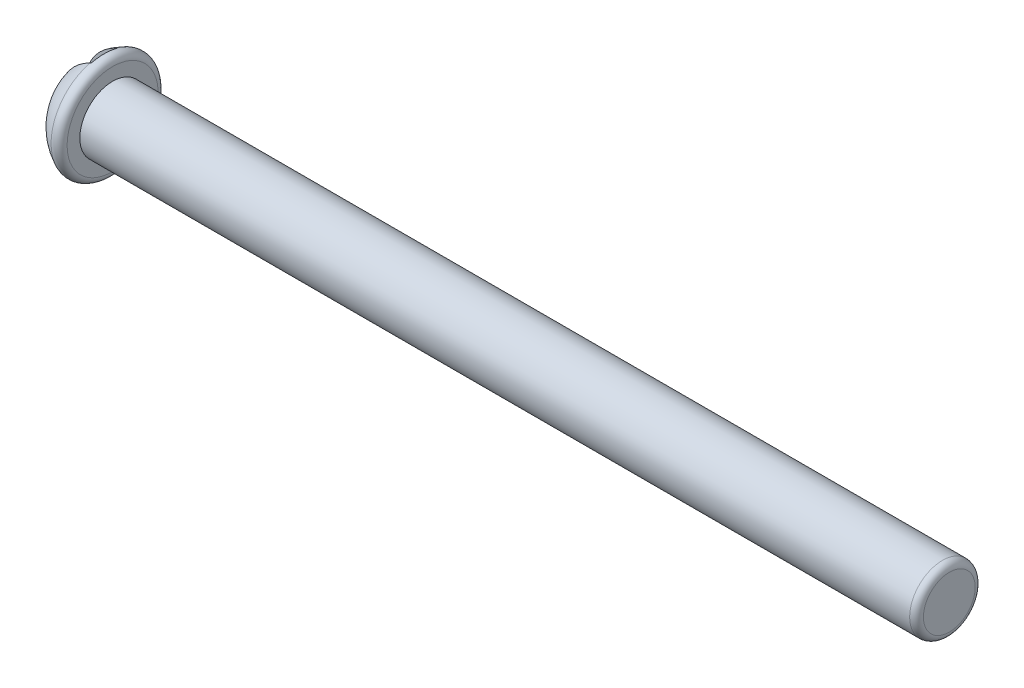
ISO-10303-21;
HEADER;
FILE_DESCRIPTION(('STEP AP214'),'2;1');
FILE_NAME('part.step','',(''),(''),'','','');
FILE_SCHEMA(('AUTOMOTIVE_DESIGN { 1 0 10303 214 1 1 1 1 }'));
ENDSEC;
DATA;
#1=APPLICATION_CONTEXT('core data for automotive mechanical design processes');
#2=APPLICATION_PROTOCOL_DEFINITION('international standard','automotive_design',2000,#1);
#3=PRODUCT_CONTEXT('',#1,'mechanical');
#4=PRODUCT('Part','Part','',(#3));
#5=PRODUCT_RELATED_PRODUCT_CATEGORY('part','',(#4));
#6=PRODUCT_DEFINITION_FORMATION('','',#4);
#7=PRODUCT_DEFINITION_CONTEXT('part definition',#1,'design');
#8=PRODUCT_DEFINITION('design','',#6,#7);
#9=PRODUCT_DEFINITION_SHAPE('','',#8);
#10=(LENGTH_UNIT() NAMED_UNIT(*) SI_UNIT(.MILLI.,.METRE.));
#11=(NAMED_UNIT(*) PLANE_ANGLE_UNIT() SI_UNIT($,.RADIAN.));
#12=(NAMED_UNIT(*) SI_UNIT($,.STERADIAN.) SOLID_ANGLE_UNIT());
#13=UNCERTAINTY_MEASURE_WITH_UNIT(LENGTH_MEASURE(1.E-05),#10,'distance_accuracy_value','');
#14=(GEOMETRIC_REPRESENTATION_CONTEXT(3) GLOBAL_UNCERTAINTY_ASSIGNED_CONTEXT((#13)) GLOBAL_UNIT_ASSIGNED_CONTEXT((#10,
#11,#12)) REPRESENTATION_CONTEXT('',''));
#15=CARTESIAN_POINT('',(0.,0.,0.));
#16=DIRECTION('',(0.,0.,1.));
#17=DIRECTION('',(1.,0.,0.));
#18=AXIS2_PLACEMENT_3D('',#15,#16,#17);
#19=CARTESIAN_POINT('',(1.649,0.,0.));
#20=DIRECTION('',(-1.,0.,0.));
#21=DIRECTION('',(0.,0.,-1.));
#22=AXIS2_PLACEMENT_3D('',#19,#20,#21);
#23=SPHERICAL_SURFACE('',#22,1.649);
#24=CARTESIAN_POINT('',(1.649,0.,0.375));
#25=DIRECTION('',(0.,0.,-1.));
#26=DIRECTION('',(-1.,0.,0.));
#27=AXIS2_PLACEMENT_3D('',#24,#25,#26);
#28=CIRCLE('',#27,1.60579450740124);
#29=CARTESIAN_POINT('',(0.967322291235335,-1.45392279759737,0.375));
#30=VERTEX_POINT('',#29);
#31=CARTESIAN_POINT('',(0.18042892579215,-0.649519052838329,0.375));
#32=VERTEX_POINT('',#31);
#33=EDGE_CURVE('E131',#30,#32,#28,.T.);
#34=ORIENTED_EDGE('',*,*,#33,.F.);
#35=CARTESIAN_POINT('',(0.967322291235335,0.,0.));
#36=DIRECTION('',(1.,0.,0.));
#37=DIRECTION('',(0.,0.,-1.));
#38=AXIS2_PLACEMENT_3D('',#35,#36,#37);
#39=CIRCLE('',#38,1.50150474570457);
#40=CARTESIAN_POINT('',(0.967322291235335,1.45392279759737,0.375));
#41=VERTEX_POINT('',#40);
#42=EDGE_CURVE('E148',#30,#41,#39,.F.);
#43=ORIENTED_EDGE('',*,*,#42,.T.);
#44=CARTESIAN_POINT('',(1.649,0.,0.375));
#45=DIRECTION('',(0.,0.,-1.));
#46=DIRECTION('',(-1.,0.,0.));
#47=AXIS2_PLACEMENT_3D('',#44,#45,#46);
#48=CIRCLE('',#47,1.60579450740124);
#49=CARTESIAN_POINT('',(0.18042892579215,0.649519052838329,0.375));
#50=VERTEX_POINT('',#49);
#51=EDGE_CURVE('E134',#50,#41,#48,.T.);
#52=ORIENTED_EDGE('',*,*,#51,.F.);
#53=CARTESIAN_POINT('',(0.18042892579215,0.,0.));
#54=DIRECTION('',(1.,0.,0.));
#55=DIRECTION('',(0.,0.,-1.));
#56=AXIS2_PLACEMENT_3D('',#53,#54,#55);
#57=CIRCLE('',#56,0.75);
#58=EDGE_CURVE('E119',#32,#50,#57,.F.);
#59=ORIENTED_EDGE('',*,*,#58,.F.);
#60=EDGE_LOOP('',(#34,#43,#52,#59));
#61=FACE_BOUND('',#60,.T.);
#62=ADVANCED_FACE('F32',(#61),#23,.T.);
#63=CARTESIAN_POINT('',(1.649,0.,-0.375));
#64=DIRECTION('',(0.,0.,1.));
#65=DIRECTION('',(1.,0.,0.));
#66=AXIS2_PLACEMENT_3D('',#63,#64,#65);
#67=CIRCLE('',#66,1.60579450740124);
#68=CARTESIAN_POINT('',(0.967322291235335,1.45392279759737,-0.375));
#69=VERTEX_POINT('',#68);
#70=CARTESIAN_POINT('',(0.18042892579215,0.649519052838329,-0.375));
#71=VERTEX_POINT('',#70);
#72=EDGE_CURVE('E136',#69,#71,#67,.T.);
#73=ORIENTED_EDGE('',*,*,#72,.F.);
#74=CARTESIAN_POINT('',(0.967322291235335,0.,0.));
#75=DIRECTION('',(1.,0.,0.));
#76=DIRECTION('',(0.,0.,-1.));
#77=AXIS2_PLACEMENT_3D('',#74,#75,#76);
#78=CIRCLE('',#77,1.50150474570457);
#79=CARTESIAN_POINT('',(0.967322291235335,-1.45392279759737,-0.375));
#80=VERTEX_POINT('',#79);
#81=EDGE_CURVE('E146',#69,#80,#78,.F.);
#82=ORIENTED_EDGE('',*,*,#81,.T.);
#83=CARTESIAN_POINT('',(1.649,0.,-0.375));
#84=DIRECTION('',(0.,0.,1.));
#85=DIRECTION('',(1.,0.,0.));
#86=AXIS2_PLACEMENT_3D('',#83,#84,#85);
#87=CIRCLE('',#86,1.60579450740124);
#88=CARTESIAN_POINT('',(0.18042892579215,-0.649519052838329,-0.375));
#89=VERTEX_POINT('',#88);
#90=EDGE_CURVE('E124',#89,#80,#87,.T.);
#91=ORIENTED_EDGE('',*,*,#90,.F.);
#92=CARTESIAN_POINT('',(0.18042892579215,0.,0.));
#93=DIRECTION('',(1.,0.,0.));
#94=DIRECTION('',(0.,0.,-1.));
#95=AXIS2_PLACEMENT_3D('',#92,#93,#94);
#96=CIRCLE('',#95,0.75);
#97=EDGE_CURVE('E138',#71,#89,#96,.F.);
#98=ORIENTED_EDGE('',*,*,#97,.F.);
#99=EDGE_LOOP('',(#73,#82,#91,#98));
#100=FACE_BOUND('',#99,.T.);
#101=ADVANCED_FACE('F174',(#100),#23,.T.);
#102=CARTESIAN_POINT('',(1.25,0.,-0.949999999999997));
#103=DIRECTION('',(-1.,0.,0.));
#104=DIRECTION('',(0.,0.,1.));
#105=AXIS2_PLACEMENT_3D('',#102,#103,#104);
#106=PLANE('',#105);
#107=CARTESIAN_POINT('',(1.25,0.,0.));
#108=DIRECTION('',(-1.,0.,0.));
#109=DIRECTION('',(0.,0.,1.));
#110=AXIS2_PLACEMENT_3D('',#107,#108,#109);
#111=CIRCLE('',#110,1.31939380019765);
#112=CARTESIAN_POINT('',(1.25,0.,1.31939380019765));
#113=VERTEX_POINT('',#112);
#114=EDGE_CURVE('E11',#113,#113,#111,.F.);
#115=ORIENTED_EDGE('',*,*,#114,.T.);
#116=EDGE_LOOP('',(#115));
#117=FACE_BOUND('',#116,.T.);
#118=CARTESIAN_POINT('',(1.25,0.,0.));
#119=DIRECTION('',(-1.,0.,0.));
#120=DIRECTION('',(0.,0.,1.));
#121=AXIS2_PLACEMENT_3D('',#118,#119,#120);
#122=CIRCLE('',#121,0.949999999999997);
#123=CARTESIAN_POINT('',(1.25,0.,0.949999999999997));
#124=VERTEX_POINT('',#123);
#125=EDGE_CURVE('E120',#124,#124,#122,.T.);
#126=ORIENTED_EDGE('',*,*,#125,.T.);
#127=EDGE_LOOP('',(#126));
#128=FACE_BOUND('',#127,.T.);
#129=ADVANCED_FACE('F170',(#117,#128),#106,.F.);
#130=CARTESIAN_POINT('',(0.,0.,0.));
#131=DIRECTION('',(-1.,0.,0.));
#132=DIRECTION('',(0.,0.,1.));
#133=AXIS2_PLACEMENT_3D('',#130,#131,#132);
#134=CYLINDRICAL_SURFACE('',#133,0.949999999999999);
#135=CARTESIAN_POINT('',(25.3,0.,0.));
#136=DIRECTION('',(-1.,0.,0.));
#137=DIRECTION('',(0.,0.,1.));
#138=AXIS2_PLACEMENT_3D('',#135,#136,#137);
#139=CIRCLE('',#138,0.949999999999999);
#140=CARTESIAN_POINT('',(25.3,0.,0.949999999999999));
#141=VERTEX_POINT('',#140);
#142=EDGE_CURVE('E140',#141,#141,#139,.T.);
#143=ORIENTED_EDGE('',*,*,#142,.T.);
#144=EDGE_LOOP('',(#143));
#145=FACE_BOUND('',#144,.T.);
#146=ORIENTED_EDGE('',*,*,#125,.F.);
#147=EDGE_LOOP('',(#146));
#148=FACE_BOUND('',#147,.T.);
#149=ADVANCED_FACE('F166',(#145,#148),#134,.T.);
#150=CARTESIAN_POINT('',(25.5,0.,0.));
#151=DIRECTION('',(-1.,0.,0.));
#152=DIRECTION('',(0.,0.,1.));
#153=AXIS2_PLACEMENT_3D('',#150,#151,#152);
#154=PLANE('',#153);
#155=CARTESIAN_POINT('',(25.5,0.,0.));
#156=DIRECTION('',(-1.,0.,0.));
#157=DIRECTION('',(0.,0.,1.));
#158=AXIS2_PLACEMENT_3D('',#155,#156,#157);
#159=CIRCLE('',#158,0.749999999999999);
#160=CARTESIAN_POINT('',(25.5,0.,0.749999999999999));
#161=VERTEX_POINT('',#160);
#162=EDGE_CURVE('E143',#161,#161,#159,.F.);
#163=ORIENTED_EDGE('',*,*,#162,.T.);
#164=EDGE_LOOP('',(#163));
#165=FACE_BOUND('',#164,.T.);
#166=ADVANCED_FACE('F162',(#165),#154,.F.);
#167=CARTESIAN_POINT('',(1.,0.649519052838329,0.375));
#168=DIRECTION('',(0.,0.,-1.));
#169=DIRECTION('',(-1.,0.,0.));
#170=AXIS2_PLACEMENT_3D('',#167,#168,#169);
#171=PLANE('',#170);
#172=ORIENTED_EDGE('',*,*,#51,.T.);
#173=CARTESIAN_POINT('',(0.967322291235335,1.45392279759737,0.375));
#174=CARTESIAN_POINT('',(0.972591774557648,1.45639324417004,0.375));
#175=CARTESIAN_POINT('',(0.977949658479528,1.45862120138841,0.375));
#176=CARTESIAN_POINT('',(0.988842228050586,1.4625921373091,0.375));
#177=CARTESIAN_POINT('',(0.994376913716911,1.46433511596438,0.375));
#178=CARTESIAN_POINT('',(0.999999999999947,1.46583560521834,0.375));
#179=B_SPLINE_CURVE_WITH_KNOTS('',3,(#173,#174,#175,#176,#177,#178),.UNSPECIFIED.,.F.,.F.,(4,2,
4),(0.,0.0174079413310437,0.0348158843502569),.UNSPECIFIED.);
#180=CARTESIAN_POINT('',(1.,1.46583560521823,0.375));
#181=VERTEX_POINT('',#180);
#182=EDGE_CURVE('E107',#41,#181,#179,.T.);
#183=ORIENTED_EDGE('',*,*,#182,.T.);
#184=DIRECTION('',(0.,-1.,0.));
#185=VECTOR('',#184,1.);
#186=CARTESIAN_POINT('',(1.,0.649519052838329,0.375));
#187=LINE('',#186,#185);
#188=CARTESIAN_POINT('',(1.,0.649519052838329,0.375));
#189=VERTEX_POINT('',#188);
#190=EDGE_CURVE('E100',#181,#189,#187,.T.);
#191=ORIENTED_EDGE('',*,*,#190,.T.);
#192=DIRECTION('',(-1.,0.,0.));
#193=VECTOR('',#192,1.);
#194=CARTESIAN_POINT('',(1.,0.649519052838329,0.375));
#195=LINE('',#194,#193);
#196=EDGE_CURVE('E105',#189,#50,#195,.T.);
#197=ORIENTED_EDGE('',*,*,#196,.T.);
#198=EDGE_LOOP('',(#172,#183,#191,#197));
#199=FACE_BOUND('',#198,.T.);
#200=ADVANCED_FACE('F103',(#199),#171,.T.);
#201=CARTESIAN_POINT('',(1.,0.,0.));
#202=DIRECTION('',(-1.,0.,0.));
#203=DIRECTION('',(0.,0.,1.));
#204=AXIS2_PLACEMENT_3D('',#201,#202,#203);
#205=CYLINDRICAL_SURFACE('',#204,0.75);
#206=ORIENTED_EDGE('',*,*,#58,.T.);
#207=ORIENTED_EDGE('',*,*,#196,.F.);
#208=CARTESIAN_POINT('',(1.,0.,0.));
#209=DIRECTION('',(1.,0.,0.));
#210=DIRECTION('',(0.,0.,-1.));
#211=AXIS2_PLACEMENT_3D('',#208,#209,#210);
#212=CIRCLE('',#211,0.75);
#213=CARTESIAN_POINT('',(1.,-0.649519052838329,0.375));
#214=VERTEX_POINT('',#213);
#215=EDGE_CURVE('E109',#189,#214,#212,.T.);
#216=ORIENTED_EDGE('',*,*,#215,.T.);
#217=DIRECTION('',(-1.,0.,0.));
#218=VECTOR('',#217,1.);
#219=CARTESIAN_POINT('',(1.,-0.649519052838329,0.375));
#220=LINE('',#219,#218);
#221=EDGE_CURVE('E121',#214,#32,#220,.T.);
#222=ORIENTED_EDGE('',*,*,#221,.T.);
#223=EDGE_LOOP('',(#206,#207,#216,#222));
#224=FACE_BOUND('',#223,.T.);
#225=ADVANCED_FACE('F117',(#224),#205,.F.);
#226=CARTESIAN_POINT('',(1.,-1.92592171681308,0.375));
#227=DIRECTION('',(0.,0.,-1.));
#228=DIRECTION('',(-1.,0.,0.));
#229=AXIS2_PLACEMENT_3D('',#226,#227,#228);
#230=PLANE('',#229);
#231=DIRECTION('',(0.,-1.,0.));
#232=VECTOR('',#231,1.);
#233=CARTESIAN_POINT('',(1.,-1.92592171681308,0.375));
#234=LINE('',#233,#232);
#235=CARTESIAN_POINT('',(1.,-1.46583560521823,0.375));
#236=VERTEX_POINT('',#235);
#237=EDGE_CURVE('E112',#214,#236,#234,.T.);
#238=ORIENTED_EDGE('',*,*,#237,.T.);
#239=CARTESIAN_POINT('',(1.,-1.46583560521823,0.375));
#240=CARTESIAN_POINT('',(0.994376913716944,-1.46433511596432,0.375));
#241=CARTESIAN_POINT('',(0.988842228050605,-1.46259213730907,0.375));
#242=CARTESIAN_POINT('',(0.977949658479526,-1.45862120138844,0.375));
#243=CARTESIAN_POINT('',(0.972591774557639,-1.45639324417008,0.375));
#244=CARTESIAN_POINT('',(0.967322291235324,-1.45392279759741,0.375));
#245=B_SPLINE_CURVE_WITH_KNOTS('',3,(#239,#240,#241,#242,#243,#244),.UNSPECIFIED.,.F.,.F.,(4,2,
4),(0.,0.0174079430192223,0.0348158843502679),.UNSPECIFIED.);
#246=EDGE_CURVE('E41',#236,#30,#245,.T.);
#247=ORIENTED_EDGE('',*,*,#246,.T.);
#248=ORIENTED_EDGE('',*,*,#33,.T.);
#249=ORIENTED_EDGE('',*,*,#221,.F.);
#250=EDGE_LOOP('',(#238,#247,#248,#249));
#251=FACE_BOUND('',#250,.T.);
#252=ADVANCED_FACE('F227',(#251),#230,.T.);
#253=CARTESIAN_POINT('',(1.,-1.92592171681308,-0.375));
#254=DIRECTION('',(0.,0.,1.));
#255=DIRECTION('',(1.,0.,0.));
#256=AXIS2_PLACEMENT_3D('',#253,#254,#255);
#257=PLANE('',#256);
#258=ORIENTED_EDGE('',*,*,#90,.T.);
#259=CARTESIAN_POINT('',(0.967322291235335,-1.45392279759737,-0.375));
#260=CARTESIAN_POINT('',(0.972591774557648,-1.45639324417004,-0.375));
#261=CARTESIAN_POINT('',(0.977949658479528,-1.45862120138841,-0.375));
#262=CARTESIAN_POINT('',(0.988842228050586,-1.4625921373091,-0.375));
#263=CARTESIAN_POINT('',(0.994376913716911,-1.46433511596438,-0.375));
#264=CARTESIAN_POINT('',(0.999999999999947,-1.46583560521834,-0.375));
#265=B_SPLINE_CURVE_WITH_KNOTS('',3,(#259,#260,#261,#262,#263,#264),.UNSPECIFIED.,.F.,.F.,(4,2,
4),(0.,0.0174079413310437,0.0348158843502569),.UNSPECIFIED.);
#266=CARTESIAN_POINT('',(1.,-1.46583560521823,-0.375));
#267=VERTEX_POINT('',#266);
#268=EDGE_CURVE('E56',#80,#267,#265,.T.);
#269=ORIENTED_EDGE('',*,*,#268,.T.);
#270=DIRECTION('',(0.,1.,0.));
#271=VECTOR('',#270,1.);
#272=CARTESIAN_POINT('',(1.,-1.92592171681308,-0.375));
#273=LINE('',#272,#271);
#274=CARTESIAN_POINT('',(1.,-0.649519052838329,-0.375));
#275=VERTEX_POINT('',#274);
#276=EDGE_CURVE('E234',#267,#275,#273,.T.);
#277=ORIENTED_EDGE('',*,*,#276,.T.);
#278=DIRECTION('',(-1.,0.,0.));
#279=VECTOR('',#278,1.);
#280=CARTESIAN_POINT('',(1.,-0.649519052838329,-0.375));
#281=LINE('',#280,#279);
#282=EDGE_CURVE('E126',#275,#89,#281,.T.);
#283=ORIENTED_EDGE('',*,*,#282,.T.);
#284=EDGE_LOOP('',(#258,#269,#277,#283));
#285=FACE_BOUND('',#284,.T.);
#286=ADVANCED_FACE('F223',(#285),#257,.T.);
#287=CARTESIAN_POINT('',(1.,0.,0.));
#288=DIRECTION('',(-1.,0.,0.));
#289=DIRECTION('',(0.,0.,1.));
#290=AXIS2_PLACEMENT_3D('',#287,#288,#289);
#291=CYLINDRICAL_SURFACE('',#290,0.75);
#292=ORIENTED_EDGE('',*,*,#97,.T.);
#293=ORIENTED_EDGE('',*,*,#282,.F.);
#294=CARTESIAN_POINT('',(1.,0.,0.));
#295=DIRECTION('',(1.,0.,0.));
#296=DIRECTION('',(0.,0.,-1.));
#297=AXIS2_PLACEMENT_3D('',#294,#295,#296);
#298=CIRCLE('',#297,0.75);
#299=CARTESIAN_POINT('',(1.,0.649519052838329,-0.375));
#300=VERTEX_POINT('',#299);
#301=EDGE_CURVE('E236',#275,#300,#298,.T.);
#302=ORIENTED_EDGE('',*,*,#301,.T.);
#303=DIRECTION('',(-1.,0.,0.));
#304=VECTOR('',#303,1.);
#305=CARTESIAN_POINT('',(1.,0.649519052838329,-0.375));
#306=LINE('',#305,#304);
#307=EDGE_CURVE('E242',#300,#71,#306,.T.);
#308=ORIENTED_EDGE('',*,*,#307,.T.);
#309=EDGE_LOOP('',(#292,#293,#302,#308));
#310=FACE_BOUND('',#309,.T.);
#311=ADVANCED_FACE('F220',(#310),#291,.F.);
#312=CARTESIAN_POINT('',(1.,0.649519052838329,-0.375));
#313=DIRECTION('',(0.,0.,1.));
#314=DIRECTION('',(1.,0.,0.));
#315=AXIS2_PLACEMENT_3D('',#312,#313,#314);
#316=PLANE('',#315);
#317=DIRECTION('',(0.,1.,0.));
#318=VECTOR('',#317,1.);
#319=CARTESIAN_POINT('',(1.,0.649519052838329,-0.375));
#320=LINE('',#319,#318);
#321=CARTESIAN_POINT('',(1.,1.46583560521823,-0.375));
#322=VERTEX_POINT('',#321);
#323=EDGE_CURVE('E240',#300,#322,#320,.T.);
#324=ORIENTED_EDGE('',*,*,#323,.T.);
#325=CARTESIAN_POINT('',(1.,1.46583560521823,-0.375));
#326=CARTESIAN_POINT('',(0.994376913716944,1.46433511596432,-0.375));
#327=CARTESIAN_POINT('',(0.988842228050605,1.46259213730907,-0.375));
#328=CARTESIAN_POINT('',(0.977949658479525,1.45862120138844,-0.375));
#329=CARTESIAN_POINT('',(0.972591774557639,1.45639324417008,-0.375));
#330=CARTESIAN_POINT('',(0.967322291235324,1.45392279759741,-0.375));
#331=B_SPLINE_CURVE_WITH_KNOTS('',3,(#325,#326,#327,#328,#329,#330),.UNSPECIFIED.,.F.,.F.,(4,2,
4),(0.,0.0174079430192224,0.0348158843502677),.UNSPECIFIED.);
#332=EDGE_CURVE('E202',#322,#69,#331,.T.);
#333=ORIENTED_EDGE('',*,*,#332,.T.);
#334=ORIENTED_EDGE('',*,*,#72,.T.);
#335=ORIENTED_EDGE('',*,*,#307,.F.);
#336=EDGE_LOOP('',(#324,#333,#334,#335));
#337=FACE_BOUND('',#336,.T.);
#338=ADVANCED_FACE('F186',(#337),#316,.T.);
#339=CARTESIAN_POINT('',(1.,0.,0.));
#340=DIRECTION('',(1.,0.,0.));
#341=DIRECTION('',(0.,0.,-1.));
#342=AXIS2_PLACEMENT_3D('',#339,#340,#341);
#343=PLANE('',#342);
#344=ORIENTED_EDGE('',*,*,#190,.F.);
#345=CARTESIAN_POINT('',(1.,0.,0.));
#346=DIRECTION('',(-1.,0.,0.));
#347=DIRECTION('',(0.,0.,1.));
#348=AXIS2_PLACEMENT_3D('',#345,#346,#347);
#349=CIRCLE('',#348,1.51304296750802);
#350=EDGE_CURVE('E200',#181,#322,#349,.T.);
#351=ORIENTED_EDGE('',*,*,#350,.T.);
#352=ORIENTED_EDGE('',*,*,#323,.F.);
#353=ORIENTED_EDGE('',*,*,#301,.F.);
#354=ORIENTED_EDGE('',*,*,#276,.F.);
#355=CARTESIAN_POINT('',(1.,0.,0.));
#356=DIRECTION('',(-1.,0.,0.));
#357=DIRECTION('',(0.,0.,1.));
#358=AXIS2_PLACEMENT_3D('',#355,#356,#357);
#359=CIRCLE('',#358,1.51304296750802);
#360=EDGE_CURVE('E48',#267,#236,#359,.T.);
#361=ORIENTED_EDGE('',*,*,#360,.T.);
#362=ORIENTED_EDGE('',*,*,#237,.F.);
#363=ORIENTED_EDGE('',*,*,#215,.F.);
#364=EDGE_LOOP('',(#344,#351,#352,#353,#354,#361,#362,#363));
#365=FACE_BOUND('',#364,.T.);
#366=ADVANCED_FACE('F111',(#365),#343,.F.);
#367=CARTESIAN_POINT('',(25.3,0.,0.));
#368=DIRECTION('',(-1.,0.,0.));
#369=DIRECTION('',(0.,0.,1.));
#370=AXIS2_PLACEMENT_3D('',#367,#368,#369);
#371=TOROIDAL_SURFACE('',#370,0.749999999999999,0.2);
#372=ORIENTED_EDGE('',*,*,#162,.F.);
#373=EDGE_LOOP('',(#372));
#374=FACE_BOUND('',#373,.T.);
#375=ORIENTED_EDGE('',*,*,#142,.F.);
#376=EDGE_LOOP('',(#375));
#377=FACE_BOUND('',#376,.T.);
#378=ADVANCED_FACE('F178',(#374,#377),#371,.T.);
#379=CARTESIAN_POINT('',(1.05,0.,0.));
#380=DIRECTION('',(-1.,0.,0.));
#381=DIRECTION('',(0.,0.,1.));
#382=AXIS2_PLACEMENT_3D('',#379,#380,#381);
#383=TOROIDAL_SURFACE('',#382,1.31939380019765,0.2);
#384=ORIENTED_EDGE('',*,*,#114,.F.);
#385=EDGE_LOOP('',(#384));
#386=FACE_BOUND('',#385,.T.);
#387=ORIENTED_EDGE('',*,*,#182,.F.);
#388=ORIENTED_EDGE('',*,*,#42,.F.);
#389=ORIENTED_EDGE('',*,*,#246,.F.);
#390=ORIENTED_EDGE('',*,*,#360,.F.);
#391=ORIENTED_EDGE('',*,*,#268,.F.);
#392=ORIENTED_EDGE('',*,*,#81,.F.);
#393=ORIENTED_EDGE('',*,*,#332,.F.);
#394=ORIENTED_EDGE('',*,*,#350,.F.);
#395=EDGE_LOOP('',(#387,#388,#389,#390,#391,#392,#393,#394));
#396=FACE_BOUND('',#395,.T.);
#397=ADVANCED_FACE('F34',(#386,#396),#383,.T.);
#398=CLOSED_SHELL('',(#62,#101,#129,#149,#166,#200,#225,#252,#286,#311,#338,#366,#378,#397));
#399=MANIFOLD_SOLID_BREP('B2',#398);
#400=ADVANCED_BREP_SHAPE_REPRESENTATION('',(#18,#399),#14);
#401=SHAPE_DEFINITION_REPRESENTATION(#9,#400);
ENDSEC;
END-ISO-10303-21;
